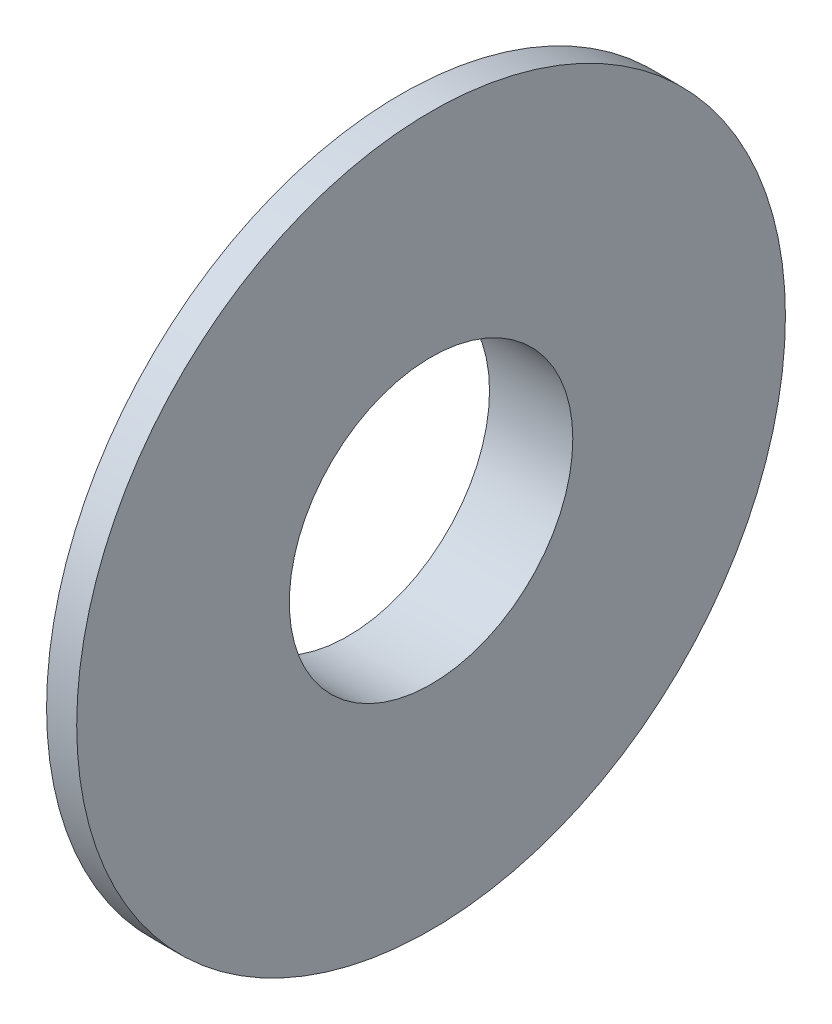
ISO-10303-21;
HEADER;
FILE_DESCRIPTION(('STEP AP214'),'2;1');
FILE_NAME('part.step','',(''),(''),'','','');
FILE_SCHEMA(('AUTOMOTIVE_DESIGN { 1 0 10303 214 1 1 1 1 }'));
ENDSEC;
DATA;
#1=APPLICATION_CONTEXT('core data for automotive mechanical design processes');
#2=APPLICATION_PROTOCOL_DEFINITION('international standard','automotive_design',2000,#1);
#3=PRODUCT_CONTEXT('',#1,'mechanical');
#4=PRODUCT('Part','Part','',(#3));
#5=PRODUCT_RELATED_PRODUCT_CATEGORY('part','',(#4));
#6=PRODUCT_DEFINITION_FORMATION('','',#4);
#7=PRODUCT_DEFINITION_CONTEXT('part definition',#1,'design');
#8=PRODUCT_DEFINITION('design','',#6,#7);
#9=PRODUCT_DEFINITION_SHAPE('','',#8);
#10=(LENGTH_UNIT() NAMED_UNIT(*) SI_UNIT(.MILLI.,.METRE.));
#11=(NAMED_UNIT(*) PLANE_ANGLE_UNIT() SI_UNIT($,.RADIAN.));
#12=(NAMED_UNIT(*) SI_UNIT($,.STERADIAN.) SOLID_ANGLE_UNIT());
#13=UNCERTAINTY_MEASURE_WITH_UNIT(LENGTH_MEASURE(1.E-05),#10,'distance_accuracy_value','');
#14=(GEOMETRIC_REPRESENTATION_CONTEXT(3) GLOBAL_UNCERTAINTY_ASSIGNED_CONTEXT((#13)) GLOBAL_UNIT_ASSIGNED_CONTEXT((#10,
#11,#12)) REPRESENTATION_CONTEXT('',''));
#15=CARTESIAN_POINT('',(0.,0.,0.));
#16=DIRECTION('',(0.,0.,1.));
#17=DIRECTION('',(1.,0.,0.));
#18=AXIS2_PLACEMENT_3D('',#15,#16,#17);
#19=CARTESIAN_POINT('',(-1.5,4.,0.));
#20=DIRECTION('',(1.,0.,0.));
#21=DIRECTION('',(0.,0.,-1.));
#22=AXIS2_PLACEMENT_3D('',#19,#20,#21);
#23=PLANE('',#22);
#24=CARTESIAN_POINT('',(-1.5,0.,0.));
#25=DIRECTION('',(1.,0.,0.));
#26=DIRECTION('',(0.,0.,-1.));
#27=AXIS2_PLACEMENT_3D('',#24,#25,#26);
#28=CIRCLE('',#27,5.5);
#29=CARTESIAN_POINT('',(-1.5,0.,-5.5));
#30=VERTEX_POINT('',#29);
#31=EDGE_CURVE('E10',#30,#30,#28,.T.);
#32=ORIENTED_EDGE('',*,*,#31,.F.);
#33=EDGE_LOOP('',(#32));
#34=FACE_BOUND('',#33,.T.);
#35=CARTESIAN_POINT('',(-1.5,0.,0.));
#36=DIRECTION('',(1.,0.,0.));
#37=DIRECTION('',(0.,0.,-1.));
#38=AXIS2_PLACEMENT_3D('',#35,#36,#37);
#39=CIRCLE('',#38,4.);
#40=CARTESIAN_POINT('',(-1.5,0.,-4.));
#41=VERTEX_POINT('',#40);
#42=EDGE_CURVE('E64',#41,#41,#39,.T.);
#43=ORIENTED_EDGE('',*,*,#42,.T.);
#44=EDGE_LOOP('',(#43));
#45=FACE_BOUND('',#44,.T.);
#46=ADVANCED_FACE('F37',(#34,#45),#23,.F.);
#47=CARTESIAN_POINT('',(-14.2672009350418,0.,0.));
#48=DIRECTION('',(1.,0.,0.));
#49=DIRECTION('',(0.,0.,-1.));
#50=AXIS2_PLACEMENT_3D('',#47,#48,#49);
#51=CYLINDRICAL_SURFACE('',#50,5.49999999999999);
#52=CARTESIAN_POINT('',(0.,0.,0.));
#53=DIRECTION('',(1.,0.,0.));
#54=DIRECTION('',(0.,0.,-1.));
#55=AXIS2_PLACEMENT_3D('',#52,#53,#54);
#56=CIRCLE('',#55,5.49999999999999);
#57=CARTESIAN_POINT('',(0.,0.,-5.49999999999999));
#58=VERTEX_POINT('',#57);
#59=EDGE_CURVE('E44',#58,#58,#56,.T.);
#60=ORIENTED_EDGE('',*,*,#59,.F.);
#61=EDGE_LOOP('',(#60));
#62=FACE_BOUND('',#61,.T.);
#63=ORIENTED_EDGE('',*,*,#31,.T.);
#64=EDGE_LOOP('',(#63));
#65=FACE_BOUND('',#64,.T.);
#66=ADVANCED_FACE('F82',(#62,#65),#51,.T.);
#67=CARTESIAN_POINT('',(0.,5.49999999999999,0.));
#68=DIRECTION('',(1.,0.,0.));
#69=DIRECTION('',(0.,0.,-1.));
#70=AXIS2_PLACEMENT_3D('',#67,#68,#69);
#71=PLANE('',#70);
#72=CARTESIAN_POINT('',(0.,0.,0.));
#73=DIRECTION('',(1.,0.,0.));
#74=DIRECTION('',(0.,0.,-1.));
#75=AXIS2_PLACEMENT_3D('',#72,#73,#74);
#76=CIRCLE('',#75,10.);
#77=CARTESIAN_POINT('',(0.,0.,-10.));
#78=VERTEX_POINT('',#77);
#79=EDGE_CURVE('E49',#78,#78,#76,.T.);
#80=ORIENTED_EDGE('',*,*,#79,.F.);
#81=EDGE_LOOP('',(#80));
#82=FACE_BOUND('',#81,.T.);
#83=ORIENTED_EDGE('',*,*,#59,.T.);
#84=EDGE_LOOP('',(#83));
#85=FACE_BOUND('',#84,.T.);
#86=ADVANCED_FACE('F87',(#82,#85),#71,.F.);
#87=CARTESIAN_POINT('',(-14.2672009350418,0.,0.));
#88=DIRECTION('',(1.,0.,0.));
#89=DIRECTION('',(0.,0.,-1.));
#90=AXIS2_PLACEMENT_3D('',#87,#88,#89);
#91=CYLINDRICAL_SURFACE('',#90,10.);
#92=CARTESIAN_POINT('',(0.85,0.,0.));
#93=DIRECTION('',(1.,0.,0.));
#94=DIRECTION('',(0.,0.,-1.));
#95=AXIS2_PLACEMENT_3D('',#92,#93,#94);
#96=CIRCLE('',#95,10.);
#97=CARTESIAN_POINT('',(0.85,0.,-10.));
#98=VERTEX_POINT('',#97);
#99=EDGE_CURVE('E54',#98,#98,#96,.T.);
#100=ORIENTED_EDGE('',*,*,#99,.F.);
#101=EDGE_LOOP('',(#100));
#102=FACE_BOUND('',#101,.T.);
#103=ORIENTED_EDGE('',*,*,#79,.T.);
#104=EDGE_LOOP('',(#103));
#105=FACE_BOUND('',#104,.T.);
#106=ADVANCED_FACE('F78',(#102,#105),#91,.T.);
#107=CARTESIAN_POINT('',(0.85,10.,0.));
#108=DIRECTION('',(-1.,0.,0.));
#109=DIRECTION('',(0.,0.,1.));
#110=AXIS2_PLACEMENT_3D('',#107,#108,#109);
#111=PLANE('',#110);
#112=CARTESIAN_POINT('',(0.85,0.,0.));
#113=DIRECTION('',(1.,0.,0.));
#114=DIRECTION('',(0.,0.,-1.));
#115=AXIS2_PLACEMENT_3D('',#112,#113,#114);
#116=CIRCLE('',#115,4.);
#117=CARTESIAN_POINT('',(0.85,0.,-4.));
#118=VERTEX_POINT('',#117);
#119=EDGE_CURVE('E60',#118,#118,#116,.T.);
#120=ORIENTED_EDGE('',*,*,#119,.F.);
#121=EDGE_LOOP('',(#120));
#122=FACE_BOUND('',#121,.T.);
#123=ORIENTED_EDGE('',*,*,#99,.T.);
#124=EDGE_LOOP('',(#123));
#125=FACE_BOUND('',#124,.T.);
#126=ADVANCED_FACE('F72',(#122,#125),#111,.F.);
#127=CARTESIAN_POINT('',(-14.2672009350418,0.,0.));
#128=DIRECTION('',(1.,0.,0.));
#129=DIRECTION('',(0.,0.,-1.));
#130=AXIS2_PLACEMENT_3D('',#127,#128,#129);
#131=CYLINDRICAL_SURFACE('',#130,4.);
#132=ORIENTED_EDGE('',*,*,#119,.T.);
#133=EDGE_LOOP('',(#132));
#134=FACE_BOUND('',#133,.T.);
#135=ORIENTED_EDGE('',*,*,#42,.F.);
#136=EDGE_LOOP('',(#135));
#137=FACE_BOUND('',#136,.T.);
#138=ADVANCED_FACE('F70',(#134,#137),#131,.F.);
#139=CLOSED_SHELL('',(#46,#66,#86,#106,#126,#138));
#140=MANIFOLD_SOLID_BREP('B2',#139);
#141=ADVANCED_BREP_SHAPE_REPRESENTATION('',(#18,#140),#14);
#142=SHAPE_DEFINITION_REPRESENTATION(#9,#141);
ENDSEC;
END-ISO-10303-21;
